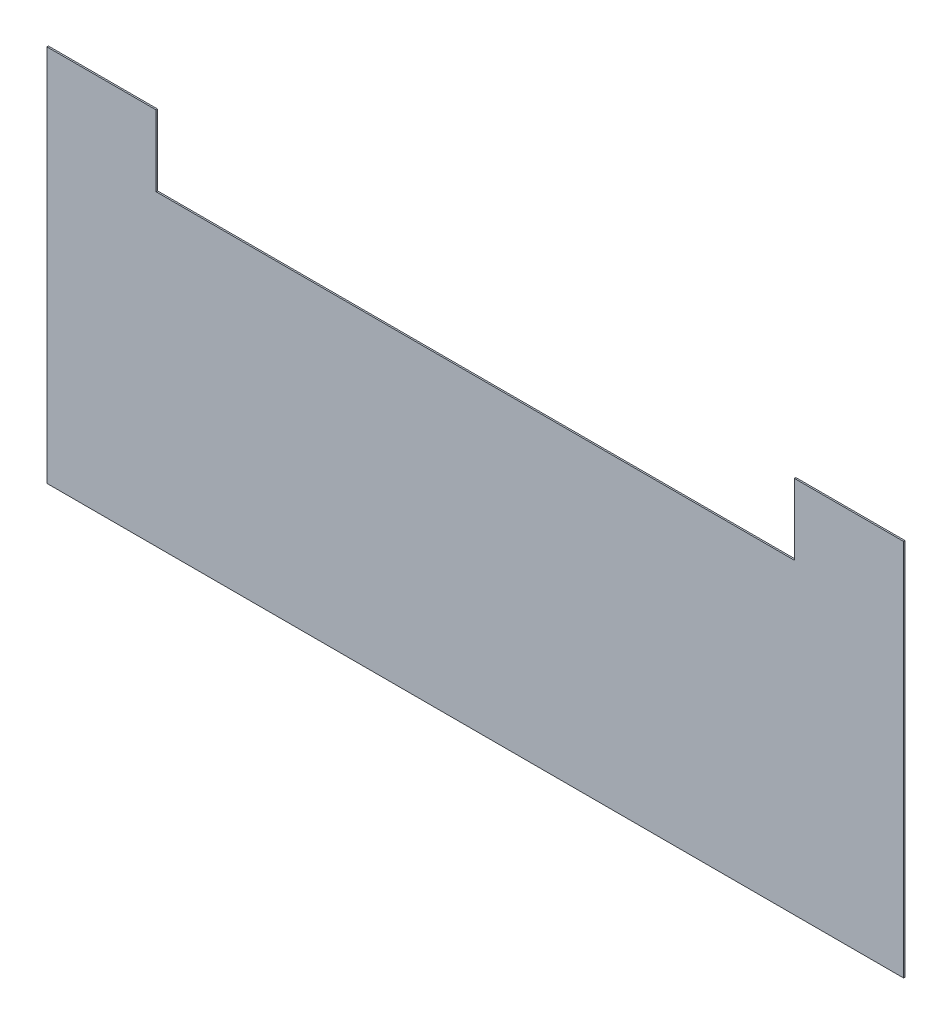
ISO-10303-21;
HEADER;
FILE_DESCRIPTION(('STEP AP214'),'2;1');
FILE_NAME('part.step','',(''),(''),'','','');
FILE_SCHEMA(('AUTOMOTIVE_DESIGN { 1 0 10303 214 1 1 1 1 }'));
ENDSEC;
DATA;
#1=APPLICATION_CONTEXT('core data for automotive mechanical design processes');
#2=APPLICATION_PROTOCOL_DEFINITION('international standard','automotive_design',2000,#1);
#3=PRODUCT_CONTEXT('',#1,'mechanical');
#4=PRODUCT('Part','Part','',(#3));
#5=PRODUCT_RELATED_PRODUCT_CATEGORY('part','',(#4));
#6=PRODUCT_DEFINITION_FORMATION('','',#4);
#7=PRODUCT_DEFINITION_CONTEXT('part definition',#1,'design');
#8=PRODUCT_DEFINITION('design','',#6,#7);
#9=PRODUCT_DEFINITION_SHAPE('','',#8);
#10=(LENGTH_UNIT() NAMED_UNIT(*) SI_UNIT(.MILLI.,.METRE.));
#11=(NAMED_UNIT(*) PLANE_ANGLE_UNIT() SI_UNIT($,.RADIAN.));
#12=(NAMED_UNIT(*) SI_UNIT($,.STERADIAN.) SOLID_ANGLE_UNIT());
#13=UNCERTAINTY_MEASURE_WITH_UNIT(LENGTH_MEASURE(1.E-05),#10,'distance_accuracy_value','');
#14=(GEOMETRIC_REPRESENTATION_CONTEXT(3) GLOBAL_UNCERTAINTY_ASSIGNED_CONTEXT((#13)) GLOBAL_UNIT_ASSIGNED_CONTEXT((#10,
#11,#12)) REPRESENTATION_CONTEXT('',''));
#15=CARTESIAN_POINT('',(0.,0.,0.));
#16=DIRECTION('',(0.,0.,1.));
#17=DIRECTION('',(1.,0.,0.));
#18=AXIS2_PLACEMENT_3D('',#15,#16,#17);
#19=CARTESIAN_POINT('',(1841.5,812.8,0.));
#20=DIRECTION('',(1.,0.,0.));
#21=DIRECTION('',(0.,0.,-1.));
#22=AXIS2_PLACEMENT_3D('',#19,#20,#21);
#23=PLANE('',#22);
#24=DIRECTION('',(0.,1.,0.));
#25=VECTOR('',#24,1.);
#26=CARTESIAN_POINT('',(1841.5,0.,0.));
#27=LINE('',#26,#25);
#28=CARTESIAN_POINT('',(1841.5,0.,0.));
#29=VERTEX_POINT('',#28);
#30=CARTESIAN_POINT('',(1841.5,812.8,0.));
#31=VERTEX_POINT('',#30);
#32=EDGE_CURVE('E34',#29,#31,#27,.T.);
#33=ORIENTED_EDGE('',*,*,#32,.F.);
#34=DIRECTION('',(0.,0.,-1.));
#35=VECTOR('',#34,1.);
#36=CARTESIAN_POINT('',(1841.5,0.,0.));
#37=LINE('',#36,#35);
#38=CARTESIAN_POINT('',(1841.5,0.,-3.175));
#39=VERTEX_POINT('',#38);
#40=EDGE_CURVE('E10',#29,#39,#37,.T.);
#41=ORIENTED_EDGE('',*,*,#40,.T.);
#42=DIRECTION('',(0.,-1.,0.));
#43=VECTOR('',#42,1.);
#44=CARTESIAN_POINT('',(1841.5,812.8,-3.175));
#45=LINE('',#44,#43);
#46=CARTESIAN_POINT('',(1841.5,812.8,-3.175));
#47=VERTEX_POINT('',#46);
#48=EDGE_CURVE('E103',#47,#39,#45,.T.);
#49=ORIENTED_EDGE('',*,*,#48,.F.);
#50=DIRECTION('',(0.,0.,-1.));
#51=VECTOR('',#50,1.);
#52=CARTESIAN_POINT('',(1841.5,812.8,0.));
#53=LINE('',#52,#51);
#54=EDGE_CURVE('E26',#31,#47,#53,.T.);
#55=ORIENTED_EDGE('',*,*,#54,.F.);
#56=EDGE_LOOP('',(#33,#41,#49,#55));
#57=FACE_BOUND('',#56,.T.);
#58=ADVANCED_FACE('F16',(#57),#23,.T.);
#59=CARTESIAN_POINT('',(1606.55,812.8,0.));
#60=DIRECTION('',(0.,1.,0.));
#61=DIRECTION('',(0.,0.,1.));
#62=AXIS2_PLACEMENT_3D('',#59,#60,#61);
#63=PLANE('',#62);
#64=DIRECTION('',(-1.,0.,0.));
#65=VECTOR('',#64,1.);
#66=CARTESIAN_POINT('',(1841.5,812.8,0.));
#67=LINE('',#66,#65);
#68=CARTESIAN_POINT('',(1606.55,812.8,0.));
#69=VERTEX_POINT('',#68);
#70=EDGE_CURVE('E108',#31,#69,#67,.T.);
#71=ORIENTED_EDGE('',*,*,#70,.F.);
#72=ORIENTED_EDGE('',*,*,#54,.T.);
#73=DIRECTION('',(1.,0.,0.));
#74=VECTOR('',#73,1.);
#75=CARTESIAN_POINT('',(1606.55,812.8,-3.175));
#76=LINE('',#75,#74);
#77=CARTESIAN_POINT('',(1606.55,812.8,-3.175));
#78=VERTEX_POINT('',#77);
#79=EDGE_CURVE('E105',#78,#47,#76,.T.);
#80=ORIENTED_EDGE('',*,*,#79,.F.);
#81=DIRECTION('',(0.,0.,-1.));
#82=VECTOR('',#81,1.);
#83=CARTESIAN_POINT('',(1606.55,812.8,0.));
#84=LINE('',#83,#82);
#85=EDGE_CURVE('E137',#69,#78,#84,.T.);
#86=ORIENTED_EDGE('',*,*,#85,.F.);
#87=EDGE_LOOP('',(#71,#72,#80,#86));
#88=FACE_BOUND('',#87,.T.);
#89=ADVANCED_FACE('F146',(#88),#63,.T.);
#90=CARTESIAN_POINT('',(1606.55,660.4,0.));
#91=DIRECTION('',(-1.,0.,0.));
#92=DIRECTION('',(0.,0.,1.));
#93=AXIS2_PLACEMENT_3D('',#90,#91,#92);
#94=PLANE('',#93);
#95=DIRECTION('',(0.,-1.,0.));
#96=VECTOR('',#95,1.);
#97=CARTESIAN_POINT('',(1606.55,812.8,0.));
#98=LINE('',#97,#96);
#99=CARTESIAN_POINT('',(1606.55,660.4,0.));
#100=VERTEX_POINT('',#99);
#101=EDGE_CURVE('E134',#69,#100,#98,.T.);
#102=ORIENTED_EDGE('',*,*,#101,.F.);
#103=ORIENTED_EDGE('',*,*,#85,.T.);
#104=DIRECTION('',(0.,1.,0.));
#105=VECTOR('',#104,1.);
#106=CARTESIAN_POINT('',(1606.55,660.4,-3.175));
#107=LINE('',#106,#105);
#108=CARTESIAN_POINT('',(1606.55,660.4,-3.175));
#109=VERTEX_POINT('',#108);
#110=EDGE_CURVE('E132',#109,#78,#107,.T.);
#111=ORIENTED_EDGE('',*,*,#110,.F.);
#112=DIRECTION('',(0.,0.,-1.));
#113=VECTOR('',#112,1.);
#114=CARTESIAN_POINT('',(1606.55,660.4,0.));
#115=LINE('',#114,#113);
#116=EDGE_CURVE('E129',#100,#109,#115,.T.);
#117=ORIENTED_EDGE('',*,*,#116,.F.);
#118=EDGE_LOOP('',(#102,#103,#111,#117));
#119=FACE_BOUND('',#118,.T.);
#120=ADVANCED_FACE('F153',(#119),#94,.T.);
#121=CARTESIAN_POINT('',(234.95,660.4,0.));
#122=DIRECTION('',(0.,1.,0.));
#123=DIRECTION('',(0.,0.,1.));
#124=AXIS2_PLACEMENT_3D('',#121,#122,#123);
#125=PLANE('',#124);
#126=DIRECTION('',(-1.,0.,0.));
#127=VECTOR('',#126,1.);
#128=CARTESIAN_POINT('',(1606.55,660.4,0.));
#129=LINE('',#128,#127);
#130=CARTESIAN_POINT('',(234.95,660.4,0.));
#131=VERTEX_POINT('',#130);
#132=EDGE_CURVE('E126',#100,#131,#129,.T.);
#133=ORIENTED_EDGE('',*,*,#132,.F.);
#134=ORIENTED_EDGE('',*,*,#116,.T.);
#135=DIRECTION('',(1.,0.,0.));
#136=VECTOR('',#135,1.);
#137=CARTESIAN_POINT('',(234.95,660.4,-3.175));
#138=LINE('',#137,#136);
#139=CARTESIAN_POINT('',(234.95,660.4,-3.175));
#140=VERTEX_POINT('',#139);
#141=EDGE_CURVE('E124',#140,#109,#138,.T.);
#142=ORIENTED_EDGE('',*,*,#141,.F.);
#143=DIRECTION('',(0.,0.,-1.));
#144=VECTOR('',#143,1.);
#145=CARTESIAN_POINT('',(234.95,660.4,0.));
#146=LINE('',#145,#144);
#147=EDGE_CURVE('E121',#131,#140,#146,.T.);
#148=ORIENTED_EDGE('',*,*,#147,.F.);
#149=EDGE_LOOP('',(#133,#134,#142,#148));
#150=FACE_BOUND('',#149,.T.);
#151=ADVANCED_FACE('F155',(#150),#125,.T.);
#152=CARTESIAN_POINT('',(234.95,812.8,0.));
#153=DIRECTION('',(1.,0.,0.));
#154=DIRECTION('',(0.,0.,-1.));
#155=AXIS2_PLACEMENT_3D('',#152,#153,#154);
#156=PLANE('',#155);
#157=DIRECTION('',(0.,1.,0.));
#158=VECTOR('',#157,1.);
#159=CARTESIAN_POINT('',(234.95,660.4,0.));
#160=LINE('',#159,#158);
#161=CARTESIAN_POINT('',(234.95,812.8,0.));
#162=VERTEX_POINT('',#161);
#163=EDGE_CURVE('E118',#131,#162,#160,.T.);
#164=ORIENTED_EDGE('',*,*,#163,.F.);
#165=ORIENTED_EDGE('',*,*,#147,.T.);
#166=DIRECTION('',(0.,-1.,0.));
#167=VECTOR('',#166,1.);
#168=CARTESIAN_POINT('',(234.95,812.8,-3.175));
#169=LINE('',#168,#167);
#170=CARTESIAN_POINT('',(234.95,812.8,-3.175));
#171=VERTEX_POINT('',#170);
#172=EDGE_CURVE('E116',#171,#140,#169,.T.);
#173=ORIENTED_EDGE('',*,*,#172,.F.);
#174=DIRECTION('',(0.,0.,-1.));
#175=VECTOR('',#174,1.);
#176=CARTESIAN_POINT('',(234.95,812.8,0.));
#177=LINE('',#176,#175);
#178=EDGE_CURVE('E114',#162,#171,#177,.T.);
#179=ORIENTED_EDGE('',*,*,#178,.F.);
#180=EDGE_LOOP('',(#164,#165,#173,#179));
#181=FACE_BOUND('',#180,.T.);
#182=ADVANCED_FACE('F159',(#181),#156,.T.);
#183=CARTESIAN_POINT('',(0.,812.8,0.));
#184=DIRECTION('',(0.,1.,0.));
#185=DIRECTION('',(0.,0.,1.));
#186=AXIS2_PLACEMENT_3D('',#183,#184,#185);
#187=PLANE('',#186);
#188=DIRECTION('',(-1.,0.,0.));
#189=VECTOR('',#188,1.);
#190=CARTESIAN_POINT('',(234.95,812.8,0.));
#191=LINE('',#190,#189);
#192=CARTESIAN_POINT('',(0.,812.8,0.));
#193=VERTEX_POINT('',#192);
#194=EDGE_CURVE('E112',#162,#193,#191,.T.);
#195=ORIENTED_EDGE('',*,*,#194,.F.);
#196=ORIENTED_EDGE('',*,*,#178,.T.);
#197=DIRECTION('',(1.,0.,0.));
#198=VECTOR('',#197,1.);
#199=CARTESIAN_POINT('',(0.,812.8,-3.175));
#200=LINE('',#199,#198);
#201=CARTESIAN_POINT('',(0.,812.8,-3.175));
#202=VERTEX_POINT('',#201);
#203=EDGE_CURVE('E94',#202,#171,#200,.T.);
#204=ORIENTED_EDGE('',*,*,#203,.F.);
#205=DIRECTION('',(0.,0.,-1.));
#206=VECTOR('',#205,1.);
#207=CARTESIAN_POINT('',(0.,812.8,0.));
#208=LINE('',#207,#206);
#209=EDGE_CURVE('E90',#193,#202,#208,.T.);
#210=ORIENTED_EDGE('',*,*,#209,.F.);
#211=EDGE_LOOP('',(#195,#196,#204,#210));
#212=FACE_BOUND('',#211,.T.);
#213=ADVANCED_FACE('F162',(#212),#187,.T.);
#214=CARTESIAN_POINT('',(0.,0.,0.));
#215=DIRECTION('',(-1.,0.,0.));
#216=DIRECTION('',(0.,0.,1.));
#217=AXIS2_PLACEMENT_3D('',#214,#215,#216);
#218=PLANE('',#217);
#219=DIRECTION('',(0.,-1.,0.));
#220=VECTOR('',#219,1.);
#221=CARTESIAN_POINT('',(0.,812.8,0.));
#222=LINE('',#221,#220);
#223=CARTESIAN_POINT('',(0.,0.,0.));
#224=VERTEX_POINT('',#223);
#225=EDGE_CURVE('E78',#193,#224,#222,.T.);
#226=ORIENTED_EDGE('',*,*,#225,.F.);
#227=ORIENTED_EDGE('',*,*,#209,.T.);
#228=DIRECTION('',(0.,1.,0.));
#229=VECTOR('',#228,1.);
#230=CARTESIAN_POINT('',(0.,0.,-3.175));
#231=LINE('',#230,#229);
#232=CARTESIAN_POINT('',(0.,0.,-3.175));
#233=VERTEX_POINT('',#232);
#234=EDGE_CURVE('E84',#233,#202,#231,.T.);
#235=ORIENTED_EDGE('',*,*,#234,.F.);
#236=DIRECTION('',(0.,0.,-1.));
#237=VECTOR('',#236,1.);
#238=CARTESIAN_POINT('',(0.,0.,0.));
#239=LINE('',#238,#237);
#240=EDGE_CURVE('E87',#224,#233,#239,.T.);
#241=ORIENTED_EDGE('',*,*,#240,.F.);
#242=EDGE_LOOP('',(#226,#227,#235,#241));
#243=FACE_BOUND('',#242,.T.);
#244=ADVANCED_FACE('F86',(#243),#218,.T.);
#245=CARTESIAN_POINT('',(1841.5,0.,0.));
#246=DIRECTION('',(0.,-1.,0.));
#247=DIRECTION('',(0.,0.,-1.));
#248=AXIS2_PLACEMENT_3D('',#245,#246,#247);
#249=PLANE('',#248);
#250=DIRECTION('',(1.,0.,0.));
#251=VECTOR('',#250,1.);
#252=CARTESIAN_POINT('',(0.,0.,0.));
#253=LINE('',#252,#251);
#254=EDGE_CURVE('E99',#224,#29,#253,.T.);
#255=ORIENTED_EDGE('',*,*,#254,.F.);
#256=ORIENTED_EDGE('',*,*,#240,.T.);
#257=DIRECTION('',(-1.,0.,0.));
#258=VECTOR('',#257,1.);
#259=CARTESIAN_POINT('',(1841.5,0.,-3.175));
#260=LINE('',#259,#258);
#261=EDGE_CURVE('E20',#39,#233,#260,.T.);
#262=ORIENTED_EDGE('',*,*,#261,.F.);
#263=ORIENTED_EDGE('',*,*,#40,.F.);
#264=EDGE_LOOP('',(#255,#256,#262,#263));
#265=FACE_BOUND('',#264,.T.);
#266=ADVANCED_FACE('F98',(#265),#249,.T.);
#267=CARTESIAN_POINT('',(920.75,387.091402714932,-3.175));
#268=DIRECTION('',(0.,0.,1.));
#269=DIRECTION('',(1.,0.,0.));
#270=AXIS2_PLACEMENT_3D('',#267,#268,#269);
#271=PLANE('',#270);
#272=ORIENTED_EDGE('',*,*,#261,.T.);
#273=ORIENTED_EDGE('',*,*,#234,.T.);
#274=ORIENTED_EDGE('',*,*,#203,.T.);
#275=ORIENTED_EDGE('',*,*,#172,.T.);
#276=ORIENTED_EDGE('',*,*,#141,.T.);
#277=ORIENTED_EDGE('',*,*,#110,.T.);
#278=ORIENTED_EDGE('',*,*,#79,.T.);
#279=ORIENTED_EDGE('',*,*,#48,.T.);
#280=EDGE_LOOP('',(#272,#273,#274,#275,#276,#277,#278,#279));
#281=FACE_BOUND('',#280,.T.);
#282=ADVANCED_FACE('F101',(#281),#271,.F.);
#283=CARTESIAN_POINT('',(920.75,387.091402714932,0.));
#284=DIRECTION('',(0.,0.,1.));
#285=DIRECTION('',(1.,0.,0.));
#286=AXIS2_PLACEMENT_3D('',#283,#284,#285);
#287=PLANE('',#286);
#288=ORIENTED_EDGE('',*,*,#254,.T.);
#289=ORIENTED_EDGE('',*,*,#32,.T.);
#290=ORIENTED_EDGE('',*,*,#70,.T.);
#291=ORIENTED_EDGE('',*,*,#101,.T.);
#292=ORIENTED_EDGE('',*,*,#132,.T.);
#293=ORIENTED_EDGE('',*,*,#163,.T.);
#294=ORIENTED_EDGE('',*,*,#194,.T.);
#295=ORIENTED_EDGE('',*,*,#225,.T.);
#296=EDGE_LOOP('',(#288,#289,#290,#291,#292,#293,#294,#295));
#297=FACE_BOUND('',#296,.T.);
#298=ADVANCED_FACE('F18',(#297),#287,.T.);
#299=CLOSED_SHELL('',(#58,#89,#120,#151,#182,#213,#244,#266,#282,#298));
#300=MANIFOLD_SOLID_BREP('B1',#299);
#301=ADVANCED_BREP_SHAPE_REPRESENTATION('',(#18,#300),#14);
#302=SHAPE_DEFINITION_REPRESENTATION(#9,#301);
ENDSEC;
END-ISO-10303-21;
